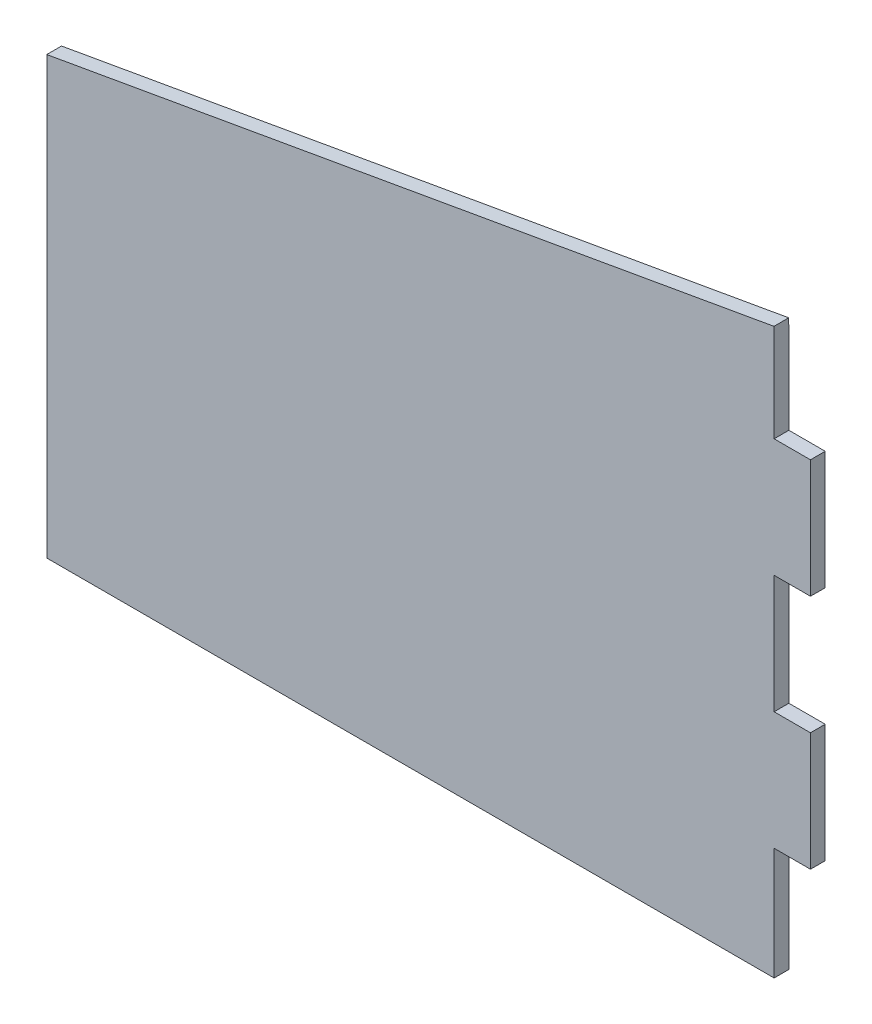
ISO-10303-21;
HEADER;
FILE_DESCRIPTION(('STEP AP214'),'2;1');
FILE_NAME('part.step','',(''),(''),'','','');
FILE_SCHEMA(('AUTOMOTIVE_DESIGN { 1 0 10303 214 1 1 1 1 }'));
ENDSEC;
DATA;
#1=APPLICATION_CONTEXT('core data for automotive mechanical design processes');
#2=APPLICATION_PROTOCOL_DEFINITION('international standard','automotive_design',2000,#1);
#3=PRODUCT_CONTEXT('',#1,'mechanical');
#4=PRODUCT('Part','Part','',(#3));
#5=PRODUCT_RELATED_PRODUCT_CATEGORY('part','',(#4));
#6=PRODUCT_DEFINITION_FORMATION('','',#4);
#7=PRODUCT_DEFINITION_CONTEXT('part definition',#1,'design');
#8=PRODUCT_DEFINITION('design','',#6,#7);
#9=PRODUCT_DEFINITION_SHAPE('','',#8);
#10=(LENGTH_UNIT() NAMED_UNIT(*) SI_UNIT(.MILLI.,.METRE.));
#11=(NAMED_UNIT(*) PLANE_ANGLE_UNIT() SI_UNIT($,.RADIAN.));
#12=(NAMED_UNIT(*) SI_UNIT($,.STERADIAN.) SOLID_ANGLE_UNIT());
#13=UNCERTAINTY_MEASURE_WITH_UNIT(LENGTH_MEASURE(1.E-05),#10,'distance_accuracy_value','');
#14=(GEOMETRIC_REPRESENTATION_CONTEXT(3) GLOBAL_UNCERTAINTY_ASSIGNED_CONTEXT((#13)) GLOBAL_UNIT_ASSIGNED_CONTEXT((#10,
#11,#12)) REPRESENTATION_CONTEXT('',''));
#15=CARTESIAN_POINT('',(0.,0.,0.));
#16=DIRECTION('',(0.,0.,1.));
#17=DIRECTION('',(1.,0.,0.));
#18=AXIS2_PLACEMENT_3D('',#15,#16,#17);
#19=CARTESIAN_POINT('',(0.,-91.4769385848753,196.208778379794));
#20=DIRECTION('',(0.999998823684039,0.00153382871882212,0.));
#21=DIRECTION('',(-0.00153382871882212,0.999998823684039,0.));
#22=AXIS2_PLACEMENT_3D('',#19,#20,#21);
#23=PLANE('',#22);
#24=DIRECTION('',(-0.00153382871882212,0.999998823684039,0.));
#25=VECTOR('',#24,1.);
#26=CARTESIAN_POINT('',(0.,-91.4769385848753,206.368778379794));
#27=LINE('',#26,#25);
#28=CARTESIAN_POINT('',(0.,-91.4769385848753,206.368778379794));
#29=VERTEX_POINT('',#28);
#30=CARTESIAN_POINT('',(-0.102720764146191,-24.5068512122774,206.368778379794));
#31=VERTEX_POINT('',#30);
#32=EDGE_CURVE('E160',#29,#31,#27,.T.);
#33=ORIENTED_EDGE('',*,*,#32,.F.);
#34=DIRECTION('',(0.,0.,1.));
#35=VECTOR('',#34,1.);
#36=CARTESIAN_POINT('',(0.,-91.4769385848753,196.208778379794));
#37=LINE('',#36,#35);
#38=CARTESIAN_POINT('',(0.,-91.4769385848753,196.208778379794));
#39=VERTEX_POINT('',#38);
#40=EDGE_CURVE('E11',#39,#29,#37,.T.);
#41=ORIENTED_EDGE('',*,*,#40,.F.);
#42=DIRECTION('',(-0.00153382871882212,0.999998823684039,0.));
#43=VECTOR('',#42,1.);
#44=CARTESIAN_POINT('',(0.,-91.4769385848753,196.208778379794));
#45=LINE('',#44,#43);
#46=CARTESIAN_POINT('',(-0.102720764146191,-24.5068512122774,196.208778379794));
#47=VERTEX_POINT('',#46);
#48=EDGE_CURVE('E192',#39,#47,#45,.T.);
#49=ORIENTED_EDGE('',*,*,#48,.T.);
#50=DIRECTION('',(0.,0.,1.));
#51=VECTOR('',#50,1.);
#52=CARTESIAN_POINT('',(-0.102720764146191,-24.5068512122774,196.208778379794));
#53=LINE('',#52,#51);
#54=EDGE_CURVE('E42',#47,#31,#53,.T.);
#55=ORIENTED_EDGE('',*,*,#54,.T.);
#56=EDGE_LOOP('',(#33,#41,#49,#55));
#57=FACE_BOUND('',#56,.T.);
#58=ADVANCED_FACE('F39',(#57),#23,.T.);
#59=CARTESIAN_POINT('',(0.,-91.4769385848753,196.208778379794));
#60=DIRECTION('',(0.,1.,0.));
#61=DIRECTION('',(0.,0.,1.));
#62=AXIS2_PLACEMENT_3D('',#59,#60,#61);
#63=PLANE('',#62);
#64=DIRECTION('',(-1.,0.,0.));
#65=VECTOR('',#64,1.);
#66=CARTESIAN_POINT('',(0.,-91.4769385848753,206.368778379794));
#67=LINE('',#66,#65);
#68=CARTESIAN_POINT('',(25.,-91.4769385848753,206.368778379794));
#69=VERTEX_POINT('',#68);
#70=EDGE_CURVE('E190',#69,#29,#67,.T.);
#71=ORIENTED_EDGE('',*,*,#70,.F.);
#72=DIRECTION('',(0.,0.,1.));
#73=VECTOR('',#72,1.);
#74=CARTESIAN_POINT('',(25.,-91.4769385848753,196.208778379794));
#75=LINE('',#74,#73);
#76=CARTESIAN_POINT('',(25.,-91.4769385848753,196.208778379794));
#77=VERTEX_POINT('',#76);
#78=EDGE_CURVE('E48',#77,#69,#75,.T.);
#79=ORIENTED_EDGE('',*,*,#78,.F.);
#80=DIRECTION('',(-1.,0.,0.));
#81=VECTOR('',#80,1.);
#82=CARTESIAN_POINT('',(0.,-91.4769385848753,196.208778379794));
#83=LINE('',#82,#81);
#84=EDGE_CURVE('E150',#77,#39,#83,.T.);
#85=ORIENTED_EDGE('',*,*,#84,.T.);
#86=ORIENTED_EDGE('',*,*,#40,.T.);
#87=EDGE_LOOP('',(#71,#79,#85,#86));
#88=FACE_BOUND('',#87,.T.);
#89=ADVANCED_FACE('F212',(#88),#63,.T.);
#90=CARTESIAN_POINT('',(25.,-172.79387716975,196.208778379794));
#91=DIRECTION('',(1.,0.,0.));
#92=DIRECTION('',(0.,0.,-1.));
#93=AXIS2_PLACEMENT_3D('',#90,#91,#92);
#94=PLANE('',#93);
#95=DIRECTION('',(0.,1.,0.));
#96=VECTOR('',#95,1.);
#97=CARTESIAN_POINT('',(25.,-172.79387716975,206.368778379794));
#98=LINE('',#97,#96);
#99=CARTESIAN_POINT('',(25.,-172.79387716975,206.368778379794));
#100=VERTEX_POINT('',#99);
#101=EDGE_CURVE('E137',#100,#69,#98,.T.);
#102=ORIENTED_EDGE('',*,*,#101,.F.);
#103=DIRECTION('',(0.,0.,1.));
#104=VECTOR('',#103,1.);
#105=CARTESIAN_POINT('',(25.,-172.79387716975,196.208778379794));
#106=LINE('',#105,#104);
#107=CARTESIAN_POINT('',(25.,-172.79387716975,196.208778379794));
#108=VERTEX_POINT('',#107);
#109=EDGE_CURVE('E132',#108,#100,#106,.T.);
#110=ORIENTED_EDGE('',*,*,#109,.F.);
#111=DIRECTION('',(0.,1.,0.));
#112=VECTOR('',#111,1.);
#113=CARTESIAN_POINT('',(25.,-172.79387716975,196.208778379794));
#114=LINE('',#113,#112);
#115=EDGE_CURVE('E135',#108,#77,#114,.T.);
#116=ORIENTED_EDGE('',*,*,#115,.T.);
#117=ORIENTED_EDGE('',*,*,#78,.T.);
#118=EDGE_LOOP('',(#102,#110,#116,#117));
#119=FACE_BOUND('',#118,.T.);
#120=ADVANCED_FACE('F134',(#119),#94,.T.);
#121=CARTESIAN_POINT('',(0.,-172.79387716975,196.208778379794));
#122=DIRECTION('',(0.,-1.,0.));
#123=DIRECTION('',(0.,0.,-1.));
#124=AXIS2_PLACEMENT_3D('',#121,#122,#123);
#125=PLANE('',#124);
#126=DIRECTION('',(1.,0.,0.));
#127=VECTOR('',#126,1.);
#128=CARTESIAN_POINT('',(0.,-172.79387716975,206.368778379794));
#129=LINE('',#128,#127);
#130=CARTESIAN_POINT('',(0.,-172.79387716975,206.368778379794));
#131=VERTEX_POINT('',#130);
#132=EDGE_CURVE('E187',#131,#100,#129,.T.);
#133=ORIENTED_EDGE('',*,*,#132,.F.);
#134=DIRECTION('',(0.,0.,1.));
#135=VECTOR('',#134,1.);
#136=CARTESIAN_POINT('',(0.,-172.79387716975,196.208778379794));
#137=LINE('',#136,#135);
#138=CARTESIAN_POINT('',(0.,-172.79387716975,196.208778379794));
#139=VERTEX_POINT('',#138);
#140=EDGE_CURVE('E142',#139,#131,#137,.T.);
#141=ORIENTED_EDGE('',*,*,#140,.F.);
#142=DIRECTION('',(1.,0.,0.));
#143=VECTOR('',#142,1.);
#144=CARTESIAN_POINT('',(0.,-172.79387716975,196.208778379794));
#145=LINE('',#144,#143);
#146=EDGE_CURVE('E148',#139,#108,#145,.T.);
#147=ORIENTED_EDGE('',*,*,#146,.T.);
#148=ORIENTED_EDGE('',*,*,#109,.T.);
#149=EDGE_LOOP('',(#133,#141,#147,#148));
#150=FACE_BOUND('',#149,.T.);
#151=ADVANCED_FACE('F152',(#150),#125,.T.);
#152=CARTESIAN_POINT('',(0.,-254.110815754626,196.208778379794));
#153=DIRECTION('',(1.,0.,0.));
#154=DIRECTION('',(0.,1.,0.));
#155=AXIS2_PLACEMENT_3D('',#152,#153,#154);
#156=PLANE('',#155);
#157=DIRECTION('',(0.,1.,0.));
#158=VECTOR('',#157,1.);
#159=CARTESIAN_POINT('',(0.,-254.110815754626,206.368778379794));
#160=LINE('',#159,#158);
#161=CARTESIAN_POINT('',(0.,-254.110815754626,206.368778379794));
#162=VERTEX_POINT('',#161);
#163=EDGE_CURVE('E184',#162,#131,#160,.T.);
#164=ORIENTED_EDGE('',*,*,#163,.F.);
#165=DIRECTION('',(0.,0.,1.));
#166=VECTOR('',#165,1.);
#167=CARTESIAN_POINT('',(0.,-254.110815754626,196.208778379794));
#168=LINE('',#167,#166);
#169=CARTESIAN_POINT('',(0.,-254.110815754626,196.208778379794));
#170=VERTEX_POINT('',#169);
#171=EDGE_CURVE('E196',#170,#162,#168,.T.);
#172=ORIENTED_EDGE('',*,*,#171,.F.);
#173=DIRECTION('',(0.,1.,0.));
#174=VECTOR('',#173,1.);
#175=CARTESIAN_POINT('',(0.,-254.110815754626,196.208778379794));
#176=LINE('',#175,#174);
#177=EDGE_CURVE('E153',#170,#139,#176,.T.);
#178=ORIENTED_EDGE('',*,*,#177,.T.);
#179=ORIENTED_EDGE('',*,*,#140,.T.);
#180=EDGE_LOOP('',(#164,#172,#178,#179));
#181=FACE_BOUND('',#180,.T.);
#182=ADVANCED_FACE('F225',(#181),#156,.T.);
#183=CARTESIAN_POINT('',(0.,-254.110815754626,196.208778379794));
#184=DIRECTION('',(0.,1.,0.));
#185=DIRECTION('',(0.,0.,1.));
#186=AXIS2_PLACEMENT_3D('',#183,#184,#185);
#187=PLANE('',#186);
#188=DIRECTION('',(-1.,0.,0.));
#189=VECTOR('',#188,1.);
#190=CARTESIAN_POINT('',(0.,-254.110815754626,206.368778379794));
#191=LINE('',#190,#189);
#192=CARTESIAN_POINT('',(25.,-254.110815754626,206.368778379794));
#193=VERTEX_POINT('',#192);
#194=EDGE_CURVE('E181',#193,#162,#191,.T.);
#195=ORIENTED_EDGE('',*,*,#194,.F.);
#196=DIRECTION('',(0.,0.,1.));
#197=VECTOR('',#196,1.);
#198=CARTESIAN_POINT('',(25.,-254.110815754626,196.208778379794));
#199=LINE('',#198,#197);
#200=CARTESIAN_POINT('',(25.,-254.110815754626,196.208778379794));
#201=VERTEX_POINT('',#200);
#202=EDGE_CURVE('E198',#201,#193,#199,.T.);
#203=ORIENTED_EDGE('',*,*,#202,.F.);
#204=DIRECTION('',(-1.,0.,0.));
#205=VECTOR('',#204,1.);
#206=CARTESIAN_POINT('',(0.,-254.110815754626,196.208778379794));
#207=LINE('',#206,#205);
#208=EDGE_CURVE('E155',#201,#170,#207,.T.);
#209=ORIENTED_EDGE('',*,*,#208,.T.);
#210=ORIENTED_EDGE('',*,*,#171,.T.);
#211=EDGE_LOOP('',(#195,#203,#209,#210));
#212=FACE_BOUND('',#211,.T.);
#213=ADVANCED_FACE('F228',(#212),#187,.T.);
#214=CARTESIAN_POINT('',(25.,-335.427754339501,196.208778379794));
#215=DIRECTION('',(1.,0.,0.));
#216=DIRECTION('',(0.,0.,-1.));
#217=AXIS2_PLACEMENT_3D('',#214,#215,#216);
#218=PLANE('',#217);
#219=DIRECTION('',(0.,1.,0.));
#220=VECTOR('',#219,1.);
#221=CARTESIAN_POINT('',(25.,-335.427754339501,206.368778379794));
#222=LINE('',#221,#220);
#223=CARTESIAN_POINT('',(25.,-335.427754339501,206.368778379794));
#224=VERTEX_POINT('',#223);
#225=EDGE_CURVE('E178',#224,#193,#222,.T.);
#226=ORIENTED_EDGE('',*,*,#225,.F.);
#227=DIRECTION('',(0.,0.,1.));
#228=VECTOR('',#227,1.);
#229=CARTESIAN_POINT('',(25.,-335.427754339501,196.208778379794));
#230=LINE('',#229,#228);
#231=CARTESIAN_POINT('',(25.,-335.427754339501,196.208778379794));
#232=VERTEX_POINT('',#231);
#233=EDGE_CURVE('E200',#232,#224,#230,.T.);
#234=ORIENTED_EDGE('',*,*,#233,.F.);
#235=DIRECTION('',(0.,1.,0.));
#236=VECTOR('',#235,1.);
#237=CARTESIAN_POINT('',(25.,-335.427754339501,196.208778379794));
#238=LINE('',#237,#236);
#239=EDGE_CURVE('E382',#232,#201,#238,.T.);
#240=ORIENTED_EDGE('',*,*,#239,.T.);
#241=ORIENTED_EDGE('',*,*,#202,.T.);
#242=EDGE_LOOP('',(#226,#234,#240,#241));
#243=FACE_BOUND('',#242,.T.);
#244=ADVANCED_FACE('F232',(#243),#218,.T.);
#245=CARTESIAN_POINT('',(0.,-335.427754339501,196.208778379794));
#246=DIRECTION('',(0.,-1.,0.));
#247=DIRECTION('',(0.,0.,-1.));
#248=AXIS2_PLACEMENT_3D('',#245,#246,#247);
#249=PLANE('',#248);
#250=DIRECTION('',(1.,0.,0.));
#251=VECTOR('',#250,1.);
#252=CARTESIAN_POINT('',(0.,-335.427754339501,206.368778379794));
#253=LINE('',#252,#251);
#254=CARTESIAN_POINT('',(0.,-335.427754339501,206.368778379794));
#255=VERTEX_POINT('',#254);
#256=EDGE_CURVE('E175',#255,#224,#253,.T.);
#257=ORIENTED_EDGE('',*,*,#256,.F.);
#258=DIRECTION('',(0.,0.,1.));
#259=VECTOR('',#258,1.);
#260=CARTESIAN_POINT('',(0.,-335.427754339501,196.208778379794));
#261=LINE('',#260,#259);
#262=CARTESIAN_POINT('',(0.,-335.427754339501,196.208778379794));
#263=VERTEX_POINT('',#262);
#264=EDGE_CURVE('E202',#263,#255,#261,.T.);
#265=ORIENTED_EDGE('',*,*,#264,.F.);
#266=DIRECTION('',(1.,0.,0.));
#267=VECTOR('',#266,1.);
#268=CARTESIAN_POINT('',(0.,-335.427754339501,196.208778379794));
#269=LINE('',#268,#267);
#270=EDGE_CURVE('E386',#263,#232,#269,.T.);
#271=ORIENTED_EDGE('',*,*,#270,.T.);
#272=ORIENTED_EDGE('',*,*,#233,.T.);
#273=EDGE_LOOP('',(#257,#265,#271,#272));
#274=FACE_BOUND('',#273,.T.);
#275=ADVANCED_FACE('F236',(#274),#249,.T.);
#276=CARTESIAN_POINT('',(-2.22044604925031E-12,-412.72012546708,196.208778379794));
#277=DIRECTION('',(1.,0.,0.));
#278=DIRECTION('',(0.,1.,0.));
#279=AXIS2_PLACEMENT_3D('',#276,#277,#278);
#280=PLANE('',#279);
#281=DIRECTION('',(0.,1.,0.));
#282=VECTOR('',#281,1.);
#283=CARTESIAN_POINT('',(-2.22044604925031E-12,-412.72012546708,206.368778379794));
#284=LINE('',#283,#282);
#285=CARTESIAN_POINT('',(-2.22044604925031E-12,-412.72012546708,206.368778379794));
#286=VERTEX_POINT('',#285);
#287=EDGE_CURVE('E172',#286,#255,#284,.T.);
#288=ORIENTED_EDGE('',*,*,#287,.F.);
#289=DIRECTION('',(0.,0.,1.));
#290=VECTOR('',#289,1.);
#291=CARTESIAN_POINT('',(-2.22044604925031E-12,-412.72012546708,196.208778379794));
#292=LINE('',#291,#290);
#293=CARTESIAN_POINT('',(-2.22044604925031E-12,-412.72012546708,196.208778379794));
#294=VERTEX_POINT('',#293);
#295=EDGE_CURVE('E204',#294,#286,#292,.T.);
#296=ORIENTED_EDGE('',*,*,#295,.F.);
#297=DIRECTION('',(0.,1.,0.));
#298=VECTOR('',#297,1.);
#299=CARTESIAN_POINT('',(-2.22044604925031E-12,-412.72012546708,196.208778379794));
#300=LINE('',#299,#298);
#301=EDGE_CURVE('E375',#294,#263,#300,.T.);
#302=ORIENTED_EDGE('',*,*,#301,.T.);
#303=ORIENTED_EDGE('',*,*,#264,.T.);
#304=EDGE_LOOP('',(#288,#296,#302,#303));
#305=FACE_BOUND('',#304,.T.);
#306=ADVANCED_FACE('F240',(#305),#280,.T.);
#307=CARTESIAN_POINT('',(-500.385059294348,-412.72012546708,196.208778379794));
#308=DIRECTION('',(0.,-1.,0.));
#309=DIRECTION('',(1.,0.,0.));
#310=AXIS2_PLACEMENT_3D('',#307,#308,#309);
#311=PLANE('',#310);
#312=DIRECTION('',(1.,0.,0.));
#313=VECTOR('',#312,1.);
#314=CARTESIAN_POINT('',(-500.385059294348,-412.72012546708,206.368778379794));
#315=LINE('',#314,#313);
#316=CARTESIAN_POINT('',(-500.385059294348,-412.72012546708,206.368778379794));
#317=VERTEX_POINT('',#316);
#318=EDGE_CURVE('E169',#317,#286,#315,.T.);
#319=ORIENTED_EDGE('',*,*,#318,.F.);
#320=DIRECTION('',(0.,0.,1.));
#321=VECTOR('',#320,1.);
#322=CARTESIAN_POINT('',(-500.385059294348,-412.72012546708,196.208778379794));
#323=LINE('',#322,#321);
#324=CARTESIAN_POINT('',(-500.385059294348,-412.72012546708,196.208778379794));
#325=VERTEX_POINT('',#324);
#326=EDGE_CURVE('E206',#325,#317,#323,.T.);
#327=ORIENTED_EDGE('',*,*,#326,.F.);
#328=DIRECTION('',(1.,0.,0.));
#329=VECTOR('',#328,1.);
#330=CARTESIAN_POINT('',(-500.385059294348,-412.72012546708,196.208778379794));
#331=LINE('',#330,#329);
#332=EDGE_CURVE('E371',#325,#294,#331,.T.);
#333=ORIENTED_EDGE('',*,*,#332,.T.);
#334=ORIENTED_EDGE('',*,*,#295,.T.);
#335=EDGE_LOOP('',(#319,#327,#333,#334));
#336=FACE_BOUND('',#335,.T.);
#337=ADVANCED_FACE('F244',(#336),#311,.T.);
#338=CARTESIAN_POINT('',(-500.385059294348,-112.72012546708,196.208778379794));
#339=DIRECTION('',(-1.,0.,0.));
#340=DIRECTION('',(0.,-1.,0.));
#341=AXIS2_PLACEMENT_3D('',#338,#339,#340);
#342=PLANE('',#341);
#343=DIRECTION('',(0.,-1.,0.));
#344=VECTOR('',#343,1.);
#345=CARTESIAN_POINT('',(-500.385059294348,-112.72012546708,206.368778379794));
#346=LINE('',#345,#344);
#347=CARTESIAN_POINT('',(-500.385059294348,-112.72012546708,206.368778379794));
#348=VERTEX_POINT('',#347);
#349=EDGE_CURVE('E166',#348,#317,#346,.T.);
#350=ORIENTED_EDGE('',*,*,#349,.F.);
#351=DIRECTION('',(0.,0.,1.));
#352=VECTOR('',#351,1.);
#353=CARTESIAN_POINT('',(-500.385059294348,-112.72012546708,196.208778379794));
#354=LINE('',#353,#352);
#355=CARTESIAN_POINT('',(-500.385059294348,-112.72012546708,196.208778379794));
#356=VERTEX_POINT('',#355);
#357=EDGE_CURVE('E207',#356,#348,#354,.T.);
#358=ORIENTED_EDGE('',*,*,#357,.F.);
#359=DIRECTION('',(0.,-1.,0.));
#360=VECTOR('',#359,1.);
#361=CARTESIAN_POINT('',(-500.385059294348,-112.72012546708,196.208778379794));
#362=LINE('',#361,#360);
#363=EDGE_CURVE('E392',#356,#325,#362,.T.);
#364=ORIENTED_EDGE('',*,*,#363,.T.);
#365=ORIENTED_EDGE('',*,*,#326,.T.);
#366=EDGE_LOOP('',(#350,#358,#364,#365));
#367=FACE_BOUND('',#366,.T.);
#368=ADVANCED_FACE('F248',(#367),#342,.T.);
#369=CARTESIAN_POINT('',(-0.102720764146191,-24.5068512122774,196.208778379794));
#370=DIRECTION('',(-0.173648177666934,0.984807753012207,0.));
#371=DIRECTION('',(-0.984807753012207,-0.173648177666935,0.));
#372=AXIS2_PLACEMENT_3D('',#369,#370,#371);
#373=PLANE('',#372);
#374=DIRECTION('',(-0.984807753012207,-0.173648177666934,0.));
#375=VECTOR('',#374,1.);
#376=CARTESIAN_POINT('',(-0.102720764146191,-24.5068512122774,206.368778379794));
#377=LINE('',#376,#375);
#378=EDGE_CURVE('E163',#31,#348,#377,.T.);
#379=ORIENTED_EDGE('',*,*,#378,.F.);
#380=ORIENTED_EDGE('',*,*,#54,.F.);
#381=DIRECTION('',(-0.984807753012207,-0.173648177666934,0.));
#382=VECTOR('',#381,1.);
#383=CARTESIAN_POINT('',(-0.102720764146191,-24.5068512122774,196.208778379794));
#384=LINE('',#383,#382);
#385=EDGE_CURVE('E394',#47,#356,#384,.T.);
#386=ORIENTED_EDGE('',*,*,#385,.T.);
#387=ORIENTED_EDGE('',*,*,#357,.T.);
#388=EDGE_LOOP('',(#379,#380,#386,#387));
#389=FACE_BOUND('',#388,.T.);
#390=ADVANCED_FACE('F209',(#389),#373,.T.);
#391=CARTESIAN_POINT('',(0.,0.,196.208778379794));
#392=DIRECTION('',(0.,0.,-1.));
#393=DIRECTION('',(-1.,0.,0.));
#394=AXIS2_PLACEMENT_3D('',#391,#392,#393);
#395=PLANE('',#394);
#396=ORIENTED_EDGE('',*,*,#48,.F.);
#397=ORIENTED_EDGE('',*,*,#84,.F.);
#398=ORIENTED_EDGE('',*,*,#115,.F.);
#399=ORIENTED_EDGE('',*,*,#146,.F.);
#400=ORIENTED_EDGE('',*,*,#177,.F.);
#401=ORIENTED_EDGE('',*,*,#208,.F.);
#402=ORIENTED_EDGE('',*,*,#239,.F.);
#403=ORIENTED_EDGE('',*,*,#270,.F.);
#404=ORIENTED_EDGE('',*,*,#301,.F.);
#405=ORIENTED_EDGE('',*,*,#332,.F.);
#406=ORIENTED_EDGE('',*,*,#363,.F.);
#407=ORIENTED_EDGE('',*,*,#385,.F.);
#408=EDGE_LOOP('',(#396,#397,#398,#399,#400,#401,#402,#403,#404,#405,#406,#407));
#409=FACE_BOUND('',#408,.T.);
#410=ADVANCED_FACE('F146',(#409),#395,.T.);
#411=CARTESIAN_POINT('',(0.,0.,206.368778379794));
#412=DIRECTION('',(0.,0.,-1.));
#413=DIRECTION('',(-1.,0.,0.));
#414=AXIS2_PLACEMENT_3D('',#411,#412,#413);
#415=PLANE('',#414);
#416=ORIENTED_EDGE('',*,*,#32,.T.);
#417=ORIENTED_EDGE('',*,*,#378,.T.);
#418=ORIENTED_EDGE('',*,*,#349,.T.);
#419=ORIENTED_EDGE('',*,*,#318,.T.);
#420=ORIENTED_EDGE('',*,*,#287,.T.);
#421=ORIENTED_EDGE('',*,*,#256,.T.);
#422=ORIENTED_EDGE('',*,*,#225,.T.);
#423=ORIENTED_EDGE('',*,*,#194,.T.);
#424=ORIENTED_EDGE('',*,*,#163,.T.);
#425=ORIENTED_EDGE('',*,*,#132,.T.);
#426=ORIENTED_EDGE('',*,*,#101,.T.);
#427=ORIENTED_EDGE('',*,*,#70,.T.);
#428=EDGE_LOOP('',(#416,#417,#418,#419,#420,#421,#422,#423,#424,#425,#426,#427));
#429=FACE_BOUND('',#428,.T.);
#430=ADVANCED_FACE('F211',(#429),#415,.F.);
#431=CLOSED_SHELL('',(#58,#89,#120,#151,#182,#213,#244,#275,#306,#337,#368,#390,#410,#430));
#432=MANIFOLD_SOLID_BREP('B2',#431);
#433=ADVANCED_BREP_SHAPE_REPRESENTATION('',(#18,#432),#14);
#434=SHAPE_DEFINITION_REPRESENTATION(#9,#433);
ENDSEC;
END-ISO-10303-21;
